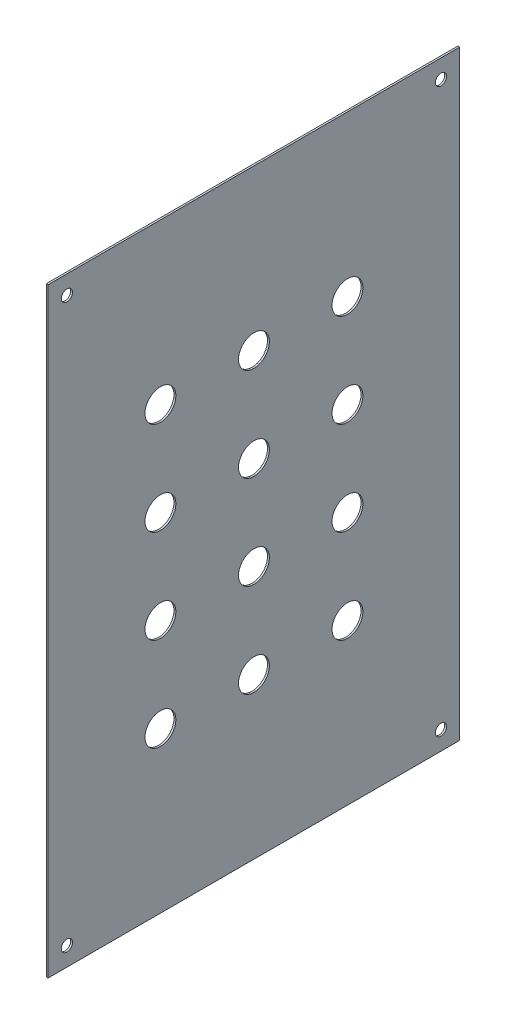
ISO-10303-21;
HEADER;
FILE_DESCRIPTION(('STEP AP214'),'2;1');
FILE_NAME('part.step','',(''),(''),'','','');
FILE_SCHEMA(('AUTOMOTIVE_DESIGN { 1 0 10303 214 1 1 1 1 }'));
ENDSEC;
DATA;
#1=APPLICATION_CONTEXT('core data for automotive mechanical design processes');
#2=APPLICATION_PROTOCOL_DEFINITION('international standard','automotive_design',2000,#1);
#3=PRODUCT_CONTEXT('',#1,'mechanical');
#4=PRODUCT('Part','Part','',(#3));
#5=PRODUCT_RELATED_PRODUCT_CATEGORY('part','',(#4));
#6=PRODUCT_DEFINITION_FORMATION('','',#4);
#7=PRODUCT_DEFINITION_CONTEXT('part definition',#1,'design');
#8=PRODUCT_DEFINITION('design','',#6,#7);
#9=PRODUCT_DEFINITION_SHAPE('','',#8);
#10=(LENGTH_UNIT() NAMED_UNIT(*) SI_UNIT(.MILLI.,.METRE.));
#11=(NAMED_UNIT(*) PLANE_ANGLE_UNIT() SI_UNIT($,.RADIAN.));
#12=(NAMED_UNIT(*) SI_UNIT($,.STERADIAN.) SOLID_ANGLE_UNIT());
#13=UNCERTAINTY_MEASURE_WITH_UNIT(LENGTH_MEASURE(1.E-05),#10,'distance_accuracy_value','');
#14=(GEOMETRIC_REPRESENTATION_CONTEXT(3) GLOBAL_UNCERTAINTY_ASSIGNED_CONTEXT((#13)) GLOBAL_UNIT_ASSIGNED_CONTEXT((#10,
#11,#12)) REPRESENTATION_CONTEXT('',''));
#15=CARTESIAN_POINT('',(0.,0.,0.));
#16=DIRECTION('',(0.,0.,1.));
#17=DIRECTION('',(1.,0.,0.));
#18=AXIS2_PLACEMENT_3D('',#15,#16,#17);
#19=CARTESIAN_POINT('',(1.,160.5,-110.));
#20=DIRECTION('',(0.,-1.,0.));
#21=DIRECTION('',(0.,0.,-1.));
#22=AXIS2_PLACEMENT_3D('',#19,#20,#21);
#23=PLANE('',#22);
#24=DIRECTION('',(0.,0.,1.));
#25=VECTOR('',#24,1.);
#26=CARTESIAN_POINT('',(0.,160.5,-110.));
#27=LINE('',#26,#25);
#28=CARTESIAN_POINT('',(0.,160.5,-110.));
#29=VERTEX_POINT('',#28);
#30=CARTESIAN_POINT('',(0.,160.5,110.));
#31=VERTEX_POINT('',#30);
#32=EDGE_CURVE('E101',#29,#31,#27,.T.);
#33=ORIENTED_EDGE('',*,*,#32,.T.);
#34=DIRECTION('',(-1.,0.,0.));
#35=VECTOR('',#34,1.);
#36=CARTESIAN_POINT('',(1.,160.5,110.));
#37=LINE('',#36,#35);
#38=CARTESIAN_POINT('',(1.,160.5,110.));
#39=VERTEX_POINT('',#38);
#40=EDGE_CURVE('E11',#39,#31,#37,.T.);
#41=ORIENTED_EDGE('',*,*,#40,.F.);
#42=DIRECTION('',(0.,0.,1.));
#43=VECTOR('',#42,1.);
#44=CARTESIAN_POINT('',(1.,160.5,-110.));
#45=LINE('',#44,#43);
#46=CARTESIAN_POINT('',(1.,160.5,-110.));
#47=VERTEX_POINT('',#46);
#48=EDGE_CURVE('E90',#47,#39,#45,.T.);
#49=ORIENTED_EDGE('',*,*,#48,.F.);
#50=DIRECTION('',(-1.,0.,0.));
#51=VECTOR('',#50,1.);
#52=CARTESIAN_POINT('',(1.,160.5,-110.));
#53=LINE('',#52,#51);
#54=EDGE_CURVE('E100',#47,#29,#53,.T.);
#55=ORIENTED_EDGE('',*,*,#54,.T.);
#56=EDGE_LOOP('',(#33,#41,#49,#55));
#57=FACE_BOUND('',#56,.T.);
#58=ADVANCED_FACE('F36',(#57),#23,.F.);
#59=CARTESIAN_POINT('',(1.,-160.5,110.));
#60=DIRECTION('',(0.,0.,-1.));
#61=DIRECTION('',(-1.,0.,0.));
#62=AXIS2_PLACEMENT_3D('',#59,#60,#61);
#63=PLANE('',#62);
#64=DIRECTION('',(0.,-1.,0.));
#65=VECTOR('',#64,1.);
#66=CARTESIAN_POINT('',(0.,-160.5,110.));
#67=LINE('',#66,#65);
#68=CARTESIAN_POINT('',(0.,-160.5,110.));
#69=VERTEX_POINT('',#68);
#70=EDGE_CURVE('E91',#31,#69,#67,.T.);
#71=ORIENTED_EDGE('',*,*,#70,.T.);
#72=DIRECTION('',(-1.,0.,0.));
#73=VECTOR('',#72,1.);
#74=CARTESIAN_POINT('',(1.,-160.5,110.));
#75=LINE('',#74,#73);
#76=CARTESIAN_POINT('',(1.,-160.5,110.));
#77=VERTEX_POINT('',#76);
#78=EDGE_CURVE('E46',#77,#69,#75,.T.);
#79=ORIENTED_EDGE('',*,*,#78,.F.);
#80=DIRECTION('',(0.,-1.,0.));
#81=VECTOR('',#80,1.);
#82=CARTESIAN_POINT('',(1.,-160.5,110.));
#83=LINE('',#82,#81);
#84=EDGE_CURVE('E82',#39,#77,#83,.T.);
#85=ORIENTED_EDGE('',*,*,#84,.F.);
#86=ORIENTED_EDGE('',*,*,#40,.T.);
#87=EDGE_LOOP('',(#71,#79,#85,#86));
#88=FACE_BOUND('',#87,.T.);
#89=ADVANCED_FACE('F95',(#88),#63,.F.);
#90=CARTESIAN_POINT('',(1.,-160.5,-110.));
#91=DIRECTION('',(0.,1.,0.));
#92=DIRECTION('',(0.,0.,1.));
#93=AXIS2_PLACEMENT_3D('',#90,#91,#92);
#94=PLANE('',#93);
#95=DIRECTION('',(0.,0.,-1.));
#96=VECTOR('',#95,1.);
#97=CARTESIAN_POINT('',(0.,-160.5,-110.));
#98=LINE('',#97,#96);
#99=CARTESIAN_POINT('',(0.,-160.5,-110.));
#100=VERTEX_POINT('',#99);
#101=EDGE_CURVE('E72',#69,#100,#98,.T.);
#102=ORIENTED_EDGE('',*,*,#101,.T.);
#103=DIRECTION('',(-1.,0.,0.));
#104=VECTOR('',#103,1.);
#105=CARTESIAN_POINT('',(1.,-160.5,-110.));
#106=LINE('',#105,#104);
#107=CARTESIAN_POINT('',(1.,-160.5,-110.));
#108=VERTEX_POINT('',#107);
#109=EDGE_CURVE('E94',#108,#100,#106,.T.);
#110=ORIENTED_EDGE('',*,*,#109,.F.);
#111=DIRECTION('',(0.,0.,-1.));
#112=VECTOR('',#111,1.);
#113=CARTESIAN_POINT('',(1.,-160.5,-110.));
#114=LINE('',#113,#112);
#115=EDGE_CURVE('E87',#77,#108,#114,.T.);
#116=ORIENTED_EDGE('',*,*,#115,.F.);
#117=ORIENTED_EDGE('',*,*,#78,.T.);
#118=EDGE_LOOP('',(#102,#110,#116,#117));
#119=FACE_BOUND('',#118,.T.);
#120=ADVANCED_FACE('F92',(#119),#94,.F.);
#121=CARTESIAN_POINT('',(1.,-160.5,-110.));
#122=DIRECTION('',(0.,0.,1.));
#123=DIRECTION('',(1.,0.,0.));
#124=AXIS2_PLACEMENT_3D('',#121,#122,#123);
#125=PLANE('',#124);
#126=DIRECTION('',(0.,1.,0.));
#127=VECTOR('',#126,1.);
#128=CARTESIAN_POINT('',(0.,-160.5,-110.));
#129=LINE('',#128,#127);
#130=EDGE_CURVE('E80',#100,#29,#129,.T.);
#131=ORIENTED_EDGE('',*,*,#130,.T.);
#132=ORIENTED_EDGE('',*,*,#54,.F.);
#133=DIRECTION('',(0.,1.,0.));
#134=VECTOR('',#133,1.);
#135=CARTESIAN_POINT('',(1.,-160.5,-110.));
#136=LINE('',#135,#134);
#137=EDGE_CURVE('E53',#108,#47,#136,.T.);
#138=ORIENTED_EDGE('',*,*,#137,.F.);
#139=ORIENTED_EDGE('',*,*,#109,.T.);
#140=EDGE_LOOP('',(#131,#132,#138,#139));
#141=FACE_BOUND('',#140,.T.);
#142=ADVANCED_FACE('F108',(#141),#125,.F.);
#143=CARTESIAN_POINT('',(1.,0.,0.));
#144=DIRECTION('',(-1.,0.,0.));
#145=DIRECTION('',(0.,0.,1.));
#146=AXIS2_PLACEMENT_3D('',#143,#144,#145);
#147=PLANE('',#146);
#148=CARTESIAN_POINT('',(1.,150.5,100.));
#149=DIRECTION('',(1.,0.,0.));
#150=DIRECTION('',(0.,0.,1.));
#151=AXIS2_PLACEMENT_3D('',#148,#149,#150);
#152=CIRCLE('',#151,2.99999999999999);
#153=CARTESIAN_POINT('',(1.,150.5,103.));
#154=VERTEX_POINT('',#153);
#155=EDGE_CURVE('E189',#154,#154,#152,.T.);
#156=ORIENTED_EDGE('',*,*,#155,.F.);
#157=EDGE_LOOP('',(#156));
#158=FACE_BOUND('',#157,.T.);
#159=CARTESIAN_POINT('',(1.,-150.5,-100.));
#160=DIRECTION('',(1.,0.,0.));
#161=DIRECTION('',(0.,0.,1.));
#162=AXIS2_PLACEMENT_3D('',#159,#160,#161);
#163=CIRCLE('',#162,2.99999999999999);
#164=CARTESIAN_POINT('',(1.,-150.5,-97.));
#165=VERTEX_POINT('',#164);
#166=EDGE_CURVE('E198',#165,#165,#163,.T.);
#167=ORIENTED_EDGE('',*,*,#166,.F.);
#168=EDGE_LOOP('',(#167));
#169=FACE_BOUND('',#168,.T.);
#170=CARTESIAN_POINT('',(1.,150.5,-100.));
#171=DIRECTION('',(1.,0.,0.));
#172=DIRECTION('',(0.,0.,-1.));
#173=AXIS2_PLACEMENT_3D('',#170,#171,#172);
#174=CIRCLE('',#173,2.99999999999999);
#175=CARTESIAN_POINT('',(1.,150.5,-103.));
#176=VERTEX_POINT('',#175);
#177=EDGE_CURVE('E197',#176,#176,#174,.T.);
#178=ORIENTED_EDGE('',*,*,#177,.F.);
#179=EDGE_LOOP('',(#178));
#180=FACE_BOUND('',#179,.T.);
#181=CARTESIAN_POINT('',(1.,-150.5,100.));
#182=DIRECTION('',(1.,0.,0.));
#183=DIRECTION('',(0.,0.,-1.));
#184=AXIS2_PLACEMENT_3D('',#181,#182,#183);
#185=CIRCLE('',#184,2.99999999999999);
#186=CARTESIAN_POINT('',(1.,-150.5,97.));
#187=VERTEX_POINT('',#186);
#188=EDGE_CURVE('E190',#187,#187,#185,.T.);
#189=ORIENTED_EDGE('',*,*,#188,.F.);
#190=EDGE_LOOP('',(#189));
#191=FACE_BOUND('',#190,.T.);
#192=CARTESIAN_POINT('',(1.,25.000000000001,-50.));
#193=DIRECTION('',(1.,0.,0.));
#194=DIRECTION('',(0.,0.,-1.));
#195=AXIS2_PLACEMENT_3D('',#192,#193,#194);
#196=CIRCLE('',#195,8.25);
#197=CARTESIAN_POINT('',(1.,25.000000000001,-58.25));
#198=VERTEX_POINT('',#197);
#199=EDGE_CURVE('E146',#198,#198,#196,.T.);
#200=ORIENTED_EDGE('',*,*,#199,.F.);
#201=EDGE_LOOP('',(#200));
#202=FACE_BOUND('',#201,.T.);
#203=CARTESIAN_POINT('',(1.,-24.999999999999,-50.));
#204=DIRECTION('',(1.,0.,0.));
#205=DIRECTION('',(0.,0.,-1.));
#206=AXIS2_PLACEMENT_3D('',#203,#204,#205);
#207=CIRCLE('',#206,8.25);
#208=CARTESIAN_POINT('',(1.,-24.999999999999,-58.25));
#209=VERTEX_POINT('',#208);
#210=EDGE_CURVE('E154',#209,#209,#207,.T.);
#211=ORIENTED_EDGE('',*,*,#210,.F.);
#212=EDGE_LOOP('',(#211));
#213=FACE_BOUND('',#212,.T.);
#214=CARTESIAN_POINT('',(1.,75.0000000000006,0.));
#215=DIRECTION('',(1.,0.,0.));
#216=DIRECTION('',(0.,0.,-1.));
#217=AXIS2_PLACEMENT_3D('',#214,#215,#216);
#218=CIRCLE('',#217,8.25);
#219=CARTESIAN_POINT('',(1.,75.0000000000006,-8.25));
#220=VERTEX_POINT('',#219);
#221=EDGE_CURVE('E161',#220,#220,#218,.T.);
#222=ORIENTED_EDGE('',*,*,#221,.F.);
#223=EDGE_LOOP('',(#222));
#224=FACE_BOUND('',#223,.T.);
#225=CARTESIAN_POINT('',(1.,25.0000000000005,0.));
#226=DIRECTION('',(1.,0.,0.));
#227=DIRECTION('',(0.,0.,-1.));
#228=AXIS2_PLACEMENT_3D('',#225,#226,#227);
#229=CIRCLE('',#228,8.25);
#230=CARTESIAN_POINT('',(1.,25.0000000000005,-8.25));
#231=VERTEX_POINT('',#230);
#232=EDGE_CURVE('E140',#231,#231,#229,.T.);
#233=ORIENTED_EDGE('',*,*,#232,.F.);
#234=EDGE_LOOP('',(#233));
#235=FACE_BOUND('',#234,.T.);
#236=CARTESIAN_POINT('',(1.,-25.,50.));
#237=DIRECTION('',(1.,0.,0.));
#238=DIRECTION('',(0.,0.,-1.));
#239=AXIS2_PLACEMENT_3D('',#236,#237,#238);
#240=CIRCLE('',#239,8.25);
#241=CARTESIAN_POINT('',(1.,-25.,41.75));
#242=VERTEX_POINT('',#241);
#243=EDGE_CURVE('E117',#242,#242,#240,.T.);
#244=ORIENTED_EDGE('',*,*,#243,.F.);
#245=EDGE_LOOP('',(#244));
#246=FACE_BOUND('',#245,.T.);
#247=CARTESIAN_POINT('',(1.,25.,50.));
#248=DIRECTION('',(1.,0.,0.));
#249=DIRECTION('',(0.,0.,-1.));
#250=AXIS2_PLACEMENT_3D('',#247,#248,#249);
#251=CIRCLE('',#250,8.25);
#252=CARTESIAN_POINT('',(1.,25.,41.75));
#253=VERTEX_POINT('',#252);
#254=EDGE_CURVE('E122',#253,#253,#251,.T.);
#255=ORIENTED_EDGE('',*,*,#254,.F.);
#256=EDGE_LOOP('',(#255));
#257=FACE_BOUND('',#256,.T.);
#258=CARTESIAN_POINT('',(1.,75.,50.));
#259=DIRECTION('',(1.,0.,0.));
#260=DIRECTION('',(0.,0.,-1.));
#261=AXIS2_PLACEMENT_3D('',#258,#259,#260);
#262=CIRCLE('',#261,8.25);
#263=CARTESIAN_POINT('',(1.,75.,41.75));
#264=VERTEX_POINT('',#263);
#265=EDGE_CURVE('E124',#264,#264,#262,.T.);
#266=ORIENTED_EDGE('',*,*,#265,.F.);
#267=EDGE_LOOP('',(#266));
#268=FACE_BOUND('',#267,.T.);
#269=CARTESIAN_POINT('',(1.,-24.9999999999995,0.));
#270=DIRECTION('',(1.,0.,0.));
#271=DIRECTION('',(0.,0.,-1.));
#272=AXIS2_PLACEMENT_3D('',#269,#270,#271);
#273=CIRCLE('',#272,8.25);
#274=CARTESIAN_POINT('',(1.,-24.9999999999995,-8.25));
#275=VERTEX_POINT('',#274);
#276=EDGE_CURVE('E138',#275,#275,#273,.T.);
#277=ORIENTED_EDGE('',*,*,#276,.F.);
#278=EDGE_LOOP('',(#277));
#279=FACE_BOUND('',#278,.T.);
#280=CARTESIAN_POINT('',(1.,-74.999999999999,-50.));
#281=DIRECTION('',(1.,0.,0.));
#282=DIRECTION('',(0.,0.,-1.));
#283=AXIS2_PLACEMENT_3D('',#280,#281,#282);
#284=CIRCLE('',#283,8.25000000000001);
#285=CARTESIAN_POINT('',(1.,-74.999999999999,-58.25));
#286=VERTEX_POINT('',#285);
#287=EDGE_CURVE('E172',#286,#286,#284,.T.);
#288=ORIENTED_EDGE('',*,*,#287,.F.);
#289=EDGE_LOOP('',(#288));
#290=FACE_BOUND('',#289,.T.);
#291=CARTESIAN_POINT('',(1.,-74.9999999999994,0.));
#292=DIRECTION('',(1.,0.,0.));
#293=DIRECTION('',(0.,0.,-1.));
#294=AXIS2_PLACEMENT_3D('',#291,#292,#293);
#295=CIRCLE('',#294,8.25000000000001);
#296=CARTESIAN_POINT('',(1.,-74.9999999999994,-8.25000000000001));
#297=VERTEX_POINT('',#296);
#298=EDGE_CURVE('E175',#297,#297,#295,.T.);
#299=ORIENTED_EDGE('',*,*,#298,.F.);
#300=EDGE_LOOP('',(#299));
#301=FACE_BOUND('',#300,.T.);
#302=CARTESIAN_POINT('',(1.,75.0000000000011,-50.));
#303=DIRECTION('',(1.,0.,0.));
#304=DIRECTION('',(0.,0.,-1.));
#305=AXIS2_PLACEMENT_3D('',#302,#303,#304);
#306=CIRCLE('',#305,8.25);
#307=CARTESIAN_POINT('',(1.,75.0000000000011,-58.25));
#308=VERTEX_POINT('',#307);
#309=EDGE_CURVE('E149',#308,#308,#306,.T.);
#310=ORIENTED_EDGE('',*,*,#309,.F.);
#311=EDGE_LOOP('',(#310));
#312=FACE_BOUND('',#311,.T.);
#313=CARTESIAN_POINT('',(1.,-75.,50.));
#314=DIRECTION('',(1.,0.,0.));
#315=DIRECTION('',(0.,0.,-1.));
#316=AXIS2_PLACEMENT_3D('',#313,#314,#315);
#317=CIRCLE('',#316,8.25);
#318=CARTESIAN_POINT('',(1.,-75.,41.75));
#319=VERTEX_POINT('',#318);
#320=EDGE_CURVE('E113',#319,#319,#317,.T.);
#321=ORIENTED_EDGE('',*,*,#320,.F.);
#322=EDGE_LOOP('',(#321));
#323=FACE_BOUND('',#322,.T.);
#324=ORIENTED_EDGE('',*,*,#48,.T.);
#325=ORIENTED_EDGE('',*,*,#84,.T.);
#326=ORIENTED_EDGE('',*,*,#115,.T.);
#327=ORIENTED_EDGE('',*,*,#137,.T.);
#328=EDGE_LOOP('',(#324,#325,#326,#327));
#329=FACE_BOUND('',#328,.T.);
#330=ADVANCED_FACE('F84',(#158,#169,#180,#191,#202,#213,#224,#235,#246,#257,#268,#279,#290,#301,
#312,#323,#329),#147,.F.);
#331=CARTESIAN_POINT('',(0.,0.,0.));
#332=DIRECTION('',(-1.,0.,0.));
#333=DIRECTION('',(0.,0.,1.));
#334=AXIS2_PLACEMENT_3D('',#331,#332,#333);
#335=PLANE('',#334);
#336=CARTESIAN_POINT('',(0.,150.5,100.));
#337=DIRECTION('',(1.,0.,0.));
#338=DIRECTION('',(0.,0.,1.));
#339=AXIS2_PLACEMENT_3D('',#336,#337,#338);
#340=CIRCLE('',#339,2.99999999999999);
#341=CARTESIAN_POINT('',(0.,150.5,103.));
#342=VERTEX_POINT('',#341);
#343=EDGE_CURVE('E199',#342,#342,#340,.T.);
#344=ORIENTED_EDGE('',*,*,#343,.T.);
#345=EDGE_LOOP('',(#344));
#346=FACE_BOUND('',#345,.T.);
#347=CARTESIAN_POINT('',(0.,-150.5,-100.));
#348=DIRECTION('',(1.,0.,0.));
#349=DIRECTION('',(0.,0.,1.));
#350=AXIS2_PLACEMENT_3D('',#347,#348,#349);
#351=CIRCLE('',#350,2.99999999999999);
#352=CARTESIAN_POINT('',(0.,-150.5,-97.));
#353=VERTEX_POINT('',#352);
#354=EDGE_CURVE('E191',#353,#353,#351,.T.);
#355=ORIENTED_EDGE('',*,*,#354,.T.);
#356=EDGE_LOOP('',(#355));
#357=FACE_BOUND('',#356,.T.);
#358=CARTESIAN_POINT('',(0.,150.5,-100.));
#359=DIRECTION('',(1.,0.,0.));
#360=DIRECTION('',(0.,0.,-1.));
#361=AXIS2_PLACEMENT_3D('',#358,#359,#360);
#362=CIRCLE('',#361,2.99999999999999);
#363=CARTESIAN_POINT('',(0.,150.5,-103.));
#364=VERTEX_POINT('',#363);
#365=EDGE_CURVE('E202',#364,#364,#362,.T.);
#366=ORIENTED_EDGE('',*,*,#365,.T.);
#367=EDGE_LOOP('',(#366));
#368=FACE_BOUND('',#367,.T.);
#369=CARTESIAN_POINT('',(0.,-150.5,100.));
#370=DIRECTION('',(1.,0.,0.));
#371=DIRECTION('',(0.,0.,-1.));
#372=AXIS2_PLACEMENT_3D('',#369,#370,#371);
#373=CIRCLE('',#372,2.99999999999999);
#374=CARTESIAN_POINT('',(0.,-150.5,97.));
#375=VERTEX_POINT('',#374);
#376=EDGE_CURVE('E184',#375,#375,#373,.T.);
#377=ORIENTED_EDGE('',*,*,#376,.T.);
#378=EDGE_LOOP('',(#377));
#379=FACE_BOUND('',#378,.T.);
#380=CARTESIAN_POINT('',(0.,25.000000000001,-50.));
#381=DIRECTION('',(1.,0.,0.));
#382=DIRECTION('',(0.,0.,-1.));
#383=AXIS2_PLACEMENT_3D('',#380,#381,#382);
#384=CIRCLE('',#383,8.25);
#385=CARTESIAN_POINT('',(0.,25.000000000001,-58.25));
#386=VERTEX_POINT('',#385);
#387=EDGE_CURVE('E144',#386,#386,#384,.T.);
#388=ORIENTED_EDGE('',*,*,#387,.T.);
#389=EDGE_LOOP('',(#388));
#390=FACE_BOUND('',#389,.T.);
#391=CARTESIAN_POINT('',(0.,-24.999999999999,-50.));
#392=DIRECTION('',(1.,0.,0.));
#393=DIRECTION('',(0.,0.,-1.));
#394=AXIS2_PLACEMENT_3D('',#391,#392,#393);
#395=CIRCLE('',#394,8.25);
#396=CARTESIAN_POINT('',(0.,-24.999999999999,-58.25));
#397=VERTEX_POINT('',#396);
#398=EDGE_CURVE('E155',#397,#397,#395,.T.);
#399=ORIENTED_EDGE('',*,*,#398,.T.);
#400=EDGE_LOOP('',(#399));
#401=FACE_BOUND('',#400,.T.);
#402=CARTESIAN_POINT('',(0.,75.0000000000006,0.));
#403=DIRECTION('',(1.,0.,0.));
#404=DIRECTION('',(0.,0.,-1.));
#405=AXIS2_PLACEMENT_3D('',#402,#403,#404);
#406=CIRCLE('',#405,8.25);
#407=CARTESIAN_POINT('',(0.,75.0000000000006,-8.25));
#408=VERTEX_POINT('',#407);
#409=EDGE_CURVE('E158',#408,#408,#406,.T.);
#410=ORIENTED_EDGE('',*,*,#409,.T.);
#411=EDGE_LOOP('',(#410));
#412=FACE_BOUND('',#411,.T.);
#413=CARTESIAN_POINT('',(0.,25.0000000000005,0.));
#414=DIRECTION('',(1.,0.,0.));
#415=DIRECTION('',(0.,0.,-1.));
#416=AXIS2_PLACEMENT_3D('',#413,#414,#415);
#417=CIRCLE('',#416,8.25);
#418=CARTESIAN_POINT('',(0.,25.0000000000005,-8.25));
#419=VERTEX_POINT('',#418);
#420=EDGE_CURVE('E163',#419,#419,#417,.T.);
#421=ORIENTED_EDGE('',*,*,#420,.T.);
#422=EDGE_LOOP('',(#421));
#423=FACE_BOUND('',#422,.T.);
#424=CARTESIAN_POINT('',(0.,-25.,50.));
#425=DIRECTION('',(1.,0.,0.));
#426=DIRECTION('',(0.,0.,-1.));
#427=AXIS2_PLACEMENT_3D('',#424,#425,#426);
#428=CIRCLE('',#427,8.25);
#429=CARTESIAN_POINT('',(0.,-25.,41.75));
#430=VERTEX_POINT('',#429);
#431=EDGE_CURVE('E126',#430,#430,#428,.T.);
#432=ORIENTED_EDGE('',*,*,#431,.T.);
#433=EDGE_LOOP('',(#432));
#434=FACE_BOUND('',#433,.T.);
#435=CARTESIAN_POINT('',(0.,25.,50.));
#436=DIRECTION('',(1.,0.,0.));
#437=DIRECTION('',(0.,0.,-1.));
#438=AXIS2_PLACEMENT_3D('',#435,#436,#437);
#439=CIRCLE('',#438,8.25);
#440=CARTESIAN_POINT('',(0.,25.,41.75));
#441=VERTEX_POINT('',#440);
#442=EDGE_CURVE('E123',#441,#441,#439,.T.);
#443=ORIENTED_EDGE('',*,*,#442,.T.);
#444=EDGE_LOOP('',(#443));
#445=FACE_BOUND('',#444,.T.);
#446=CARTESIAN_POINT('',(0.,75.,50.));
#447=DIRECTION('',(1.,0.,0.));
#448=DIRECTION('',(0.,0.,-1.));
#449=AXIS2_PLACEMENT_3D('',#446,#447,#448);
#450=CIRCLE('',#449,8.25);
#451=CARTESIAN_POINT('',(0.,75.,41.75));
#452=VERTEX_POINT('',#451);
#453=EDGE_CURVE('E139',#452,#452,#450,.T.);
#454=ORIENTED_EDGE('',*,*,#453,.T.);
#455=EDGE_LOOP('',(#454));
#456=FACE_BOUND('',#455,.T.);
#457=CARTESIAN_POINT('',(0.,-24.9999999999995,0.));
#458=DIRECTION('',(1.,0.,0.));
#459=DIRECTION('',(0.,0.,-1.));
#460=AXIS2_PLACEMENT_3D('',#457,#458,#459);
#461=CIRCLE('',#460,8.25);
#462=CARTESIAN_POINT('',(0.,-24.9999999999995,-8.25));
#463=VERTEX_POINT('',#462);
#464=EDGE_CURVE('E132',#463,#463,#461,.T.);
#465=ORIENTED_EDGE('',*,*,#464,.T.);
#466=EDGE_LOOP('',(#465));
#467=FACE_BOUND('',#466,.T.);
#468=CARTESIAN_POINT('',(0.,-74.999999999999,-50.));
#469=DIRECTION('',(1.,0.,0.));
#470=DIRECTION('',(0.,0.,-1.));
#471=AXIS2_PLACEMENT_3D('',#468,#469,#470);
#472=CIRCLE('',#471,8.25000000000001);
#473=CARTESIAN_POINT('',(0.,-74.999999999999,-58.25));
#474=VERTEX_POINT('',#473);
#475=EDGE_CURVE('E182',#474,#474,#472,.T.);
#476=ORIENTED_EDGE('',*,*,#475,.T.);
#477=EDGE_LOOP('',(#476));
#478=FACE_BOUND('',#477,.T.);
#479=CARTESIAN_POINT('',(0.,-74.9999999999994,0.));
#480=DIRECTION('',(1.,0.,0.));
#481=DIRECTION('',(0.,0.,-1.));
#482=AXIS2_PLACEMENT_3D('',#479,#480,#481);
#483=CIRCLE('',#482,8.25000000000001);
#484=CARTESIAN_POINT('',(0.,-74.9999999999994,-8.25000000000001));
#485=VERTEX_POINT('',#484);
#486=EDGE_CURVE('E166',#485,#485,#483,.T.);
#487=ORIENTED_EDGE('',*,*,#486,.T.);
#488=EDGE_LOOP('',(#487));
#489=FACE_BOUND('',#488,.T.);
#490=CARTESIAN_POINT('',(0.,75.0000000000011,-50.));
#491=DIRECTION('',(1.,0.,0.));
#492=DIRECTION('',(0.,0.,-1.));
#493=AXIS2_PLACEMENT_3D('',#490,#491,#492);
#494=CIRCLE('',#493,8.25);
#495=CARTESIAN_POINT('',(0.,75.0000000000011,-58.25));
#496=VERTEX_POINT('',#495);
#497=EDGE_CURVE('E178',#496,#496,#494,.T.);
#498=ORIENTED_EDGE('',*,*,#497,.T.);
#499=EDGE_LOOP('',(#498));
#500=FACE_BOUND('',#499,.T.);
#501=CARTESIAN_POINT('',(0.,-75.,50.));
#502=DIRECTION('',(1.,0.,0.));
#503=DIRECTION('',(0.,0.,-1.));
#504=AXIS2_PLACEMENT_3D('',#501,#502,#503);
#505=CIRCLE('',#504,8.25);
#506=CARTESIAN_POINT('',(0.,-75.,41.75));
#507=VERTEX_POINT('',#506);
#508=EDGE_CURVE('E102',#507,#507,#505,.T.);
#509=ORIENTED_EDGE('',*,*,#508,.T.);
#510=EDGE_LOOP('',(#509));
#511=FACE_BOUND('',#510,.T.);
#512=ORIENTED_EDGE('',*,*,#32,.F.);
#513=ORIENTED_EDGE('',*,*,#130,.F.);
#514=ORIENTED_EDGE('',*,*,#101,.F.);
#515=ORIENTED_EDGE('',*,*,#70,.F.);
#516=EDGE_LOOP('',(#512,#513,#514,#515));
#517=FACE_BOUND('',#516,.T.);
#518=ADVANCED_FACE('F115',(#346,#357,#368,#379,#390,#401,#412,#423,#434,#445,#456,#467,#478,
#489,#500,#511,#517),#335,.T.);
#519=CARTESIAN_POINT('',(0.,-75.,50.));
#520=DIRECTION('',(1.,0.,0.));
#521=DIRECTION('',(0.,0.,-1.));
#522=AXIS2_PLACEMENT_3D('',#519,#520,#521);
#523=CYLINDRICAL_SURFACE('',#522,8.25);
#524=ORIENTED_EDGE('',*,*,#508,.F.);
#525=EDGE_LOOP('',(#524));
#526=FACE_BOUND('',#525,.T.);
#527=ORIENTED_EDGE('',*,*,#320,.T.);
#528=EDGE_LOOP('',(#527));
#529=FACE_BOUND('',#528,.T.);
#530=ADVANCED_FACE('F242',(#526,#529),#523,.F.);
#531=CARTESIAN_POINT('',(0.,75.0000000000011,-50.));
#532=DIRECTION('',(1.,0.,0.));
#533=DIRECTION('',(0.,0.,-1.));
#534=AXIS2_PLACEMENT_3D('',#531,#532,#533);
#535=CYLINDRICAL_SURFACE('',#534,8.25);
#536=ORIENTED_EDGE('',*,*,#497,.F.);
#537=EDGE_LOOP('',(#536));
#538=FACE_BOUND('',#537,.T.);
#539=ORIENTED_EDGE('',*,*,#309,.T.);
#540=EDGE_LOOP('',(#539));
#541=FACE_BOUND('',#540,.T.);
#542=ADVANCED_FACE('F244',(#538,#541),#535,.F.);
#543=CARTESIAN_POINT('',(0.,-74.9999999999994,0.));
#544=DIRECTION('',(1.,0.,0.));
#545=DIRECTION('',(0.,0.,-1.));
#546=AXIS2_PLACEMENT_3D('',#543,#544,#545);
#547=CYLINDRICAL_SURFACE('',#546,8.25000000000001);
#548=ORIENTED_EDGE('',*,*,#486,.F.);
#549=EDGE_LOOP('',(#548));
#550=FACE_BOUND('',#549,.T.);
#551=ORIENTED_EDGE('',*,*,#298,.T.);
#552=EDGE_LOOP('',(#551));
#553=FACE_BOUND('',#552,.T.);
#554=ADVANCED_FACE('F252',(#550,#553),#547,.F.);
#555=CARTESIAN_POINT('',(0.,-74.999999999999,-50.));
#556=DIRECTION('',(1.,0.,0.));
#557=DIRECTION('',(0.,0.,-1.));
#558=AXIS2_PLACEMENT_3D('',#555,#556,#557);
#559=CYLINDRICAL_SURFACE('',#558,8.25000000000001);
#560=ORIENTED_EDGE('',*,*,#475,.F.);
#561=EDGE_LOOP('',(#560));
#562=FACE_BOUND('',#561,.T.);
#563=ORIENTED_EDGE('',*,*,#287,.T.);
#564=EDGE_LOOP('',(#563));
#565=FACE_BOUND('',#564,.T.);
#566=ADVANCED_FACE('F311',(#562,#565),#559,.F.);
#567=CARTESIAN_POINT('',(0.,-24.9999999999995,0.));
#568=DIRECTION('',(1.,0.,0.));
#569=DIRECTION('',(0.,0.,-1.));
#570=AXIS2_PLACEMENT_3D('',#567,#568,#569);
#571=CYLINDRICAL_SURFACE('',#570,8.25);
#572=ORIENTED_EDGE('',*,*,#464,.F.);
#573=EDGE_LOOP('',(#572));
#574=FACE_BOUND('',#573,.T.);
#575=ORIENTED_EDGE('',*,*,#276,.T.);
#576=EDGE_LOOP('',(#575));
#577=FACE_BOUND('',#576,.T.);
#578=ADVANCED_FACE('F325',(#574,#577),#571,.F.);
#579=CARTESIAN_POINT('',(0.,75.,50.));
#580=DIRECTION('',(1.,0.,0.));
#581=DIRECTION('',(0.,0.,-1.));
#582=AXIS2_PLACEMENT_3D('',#579,#580,#581);
#583=CYLINDRICAL_SURFACE('',#582,8.25);
#584=ORIENTED_EDGE('',*,*,#453,.F.);
#585=EDGE_LOOP('',(#584));
#586=FACE_BOUND('',#585,.T.);
#587=ORIENTED_EDGE('',*,*,#265,.T.);
#588=EDGE_LOOP('',(#587));
#589=FACE_BOUND('',#588,.T.);
#590=ADVANCED_FACE('F332',(#586,#589),#583,.F.);
#591=CARTESIAN_POINT('',(0.,25.,50.));
#592=DIRECTION('',(1.,0.,0.));
#593=DIRECTION('',(0.,0.,-1.));
#594=AXIS2_PLACEMENT_3D('',#591,#592,#593);
#595=CYLINDRICAL_SURFACE('',#594,8.25);
#596=ORIENTED_EDGE('',*,*,#442,.F.);
#597=EDGE_LOOP('',(#596));
#598=FACE_BOUND('',#597,.T.);
#599=ORIENTED_EDGE('',*,*,#254,.T.);
#600=EDGE_LOOP('',(#599));
#601=FACE_BOUND('',#600,.T.);
#602=ADVANCED_FACE('F339',(#598,#601),#595,.F.);
#603=CARTESIAN_POINT('',(0.,-25.,50.));
#604=DIRECTION('',(1.,0.,0.));
#605=DIRECTION('',(0.,0.,-1.));
#606=AXIS2_PLACEMENT_3D('',#603,#604,#605);
#607=CYLINDRICAL_SURFACE('',#606,8.25);
#608=ORIENTED_EDGE('',*,*,#431,.F.);
#609=EDGE_LOOP('',(#608));
#610=FACE_BOUND('',#609,.T.);
#611=ORIENTED_EDGE('',*,*,#243,.T.);
#612=EDGE_LOOP('',(#611));
#613=FACE_BOUND('',#612,.T.);
#614=ADVANCED_FACE('F349',(#610,#613),#607,.F.);
#615=CARTESIAN_POINT('',(0.,25.0000000000005,0.));
#616=DIRECTION('',(1.,0.,0.));
#617=DIRECTION('',(0.,0.,-1.));
#618=AXIS2_PLACEMENT_3D('',#615,#616,#617);
#619=CYLINDRICAL_SURFACE('',#618,8.25);
#620=ORIENTED_EDGE('',*,*,#420,.F.);
#621=EDGE_LOOP('',(#620));
#622=FACE_BOUND('',#621,.T.);
#623=ORIENTED_EDGE('',*,*,#232,.T.);
#624=EDGE_LOOP('',(#623));
#625=FACE_BOUND('',#624,.T.);
#626=ADVANCED_FACE('F360',(#622,#625),#619,.F.);
#627=CARTESIAN_POINT('',(0.,75.0000000000006,0.));
#628=DIRECTION('',(1.,0.,0.));
#629=DIRECTION('',(0.,0.,-1.));
#630=AXIS2_PLACEMENT_3D('',#627,#628,#629);
#631=CYLINDRICAL_SURFACE('',#630,8.25);
#632=ORIENTED_EDGE('',*,*,#409,.F.);
#633=EDGE_LOOP('',(#632));
#634=FACE_BOUND('',#633,.T.);
#635=ORIENTED_EDGE('',*,*,#221,.T.);
#636=EDGE_LOOP('',(#635));
#637=FACE_BOUND('',#636,.T.);
#638=ADVANCED_FACE('F368',(#634,#637),#631,.F.);
#639=CARTESIAN_POINT('',(0.,-24.999999999999,-50.));
#640=DIRECTION('',(1.,0.,0.));
#641=DIRECTION('',(0.,0.,-1.));
#642=AXIS2_PLACEMENT_3D('',#639,#640,#641);
#643=CYLINDRICAL_SURFACE('',#642,8.25);
#644=ORIENTED_EDGE('',*,*,#398,.F.);
#645=EDGE_LOOP('',(#644));
#646=FACE_BOUND('',#645,.T.);
#647=ORIENTED_EDGE('',*,*,#210,.T.);
#648=EDGE_LOOP('',(#647));
#649=FACE_BOUND('',#648,.T.);
#650=ADVANCED_FACE('F374',(#646,#649),#643,.F.);
#651=CARTESIAN_POINT('',(0.,25.000000000001,-50.));
#652=DIRECTION('',(1.,0.,0.));
#653=DIRECTION('',(0.,0.,-1.));
#654=AXIS2_PLACEMENT_3D('',#651,#652,#653);
#655=CYLINDRICAL_SURFACE('',#654,8.25);
#656=ORIENTED_EDGE('',*,*,#387,.F.);
#657=EDGE_LOOP('',(#656));
#658=FACE_BOUND('',#657,.T.);
#659=ORIENTED_EDGE('',*,*,#199,.T.);
#660=EDGE_LOOP('',(#659));
#661=FACE_BOUND('',#660,.T.);
#662=ADVANCED_FACE('F383',(#658,#661),#655,.F.);
#663=CARTESIAN_POINT('',(0.,-150.5,100.));
#664=DIRECTION('',(1.,0.,0.));
#665=DIRECTION('',(0.,0.,-1.));
#666=AXIS2_PLACEMENT_3D('',#663,#664,#665);
#667=CYLINDRICAL_SURFACE('',#666,2.99999999999999);
#668=ORIENTED_EDGE('',*,*,#376,.F.);
#669=EDGE_LOOP('',(#668));
#670=FACE_BOUND('',#669,.T.);
#671=ORIENTED_EDGE('',*,*,#188,.T.);
#672=EDGE_LOOP('',(#671));
#673=FACE_BOUND('',#672,.T.);
#674=ADVANCED_FACE('F392',(#670,#673),#667,.F.);
#675=CARTESIAN_POINT('',(0.,150.5,-100.));
#676=DIRECTION('',(1.,0.,0.));
#677=DIRECTION('',(0.,0.,-1.));
#678=AXIS2_PLACEMENT_3D('',#675,#676,#677);
#679=CYLINDRICAL_SURFACE('',#678,2.99999999999999);
#680=ORIENTED_EDGE('',*,*,#365,.F.);
#681=EDGE_LOOP('',(#680));
#682=FACE_BOUND('',#681,.T.);
#683=ORIENTED_EDGE('',*,*,#177,.T.);
#684=EDGE_LOOP('',(#683));
#685=FACE_BOUND('',#684,.T.);
#686=ADVANCED_FACE('F211',(#682,#685),#679,.F.);
#687=CARTESIAN_POINT('',(0.,-150.5,-100.));
#688=DIRECTION('',(1.,0.,0.));
#689=DIRECTION('',(0.,0.,-1.));
#690=AXIS2_PLACEMENT_3D('',#687,#688,#689);
#691=CYLINDRICAL_SURFACE('',#690,2.99999999999999);
#692=ORIENTED_EDGE('',*,*,#354,.F.);
#693=EDGE_LOOP('',(#692));
#694=FACE_BOUND('',#693,.T.);
#695=ORIENTED_EDGE('',*,*,#166,.T.);
#696=EDGE_LOOP('',(#695));
#697=FACE_BOUND('',#696,.T.);
#698=ADVANCED_FACE('F409',(#694,#697),#691,.F.);
#699=CARTESIAN_POINT('',(0.,150.5,100.));
#700=DIRECTION('',(1.,0.,0.));
#701=DIRECTION('',(0.,0.,-1.));
#702=AXIS2_PLACEMENT_3D('',#699,#700,#701);
#703=CYLINDRICAL_SURFACE('',#702,2.99999999999999);
#704=ORIENTED_EDGE('',*,*,#343,.F.);
#705=EDGE_LOOP('',(#704));
#706=FACE_BOUND('',#705,.T.);
#707=ORIENTED_EDGE('',*,*,#155,.T.);
#708=EDGE_LOOP('',(#707));
#709=FACE_BOUND('',#708,.T.);
#710=ADVANCED_FACE('F420',(#706,#709),#703,.F.);
#711=CLOSED_SHELL('',(#58,#89,#120,#142,#330,#518,#530,#542,#554,#566,#578,#590,#602,#614,#626,
#638,#650,#662,#674,#686,#698,#710));
#712=MANIFOLD_SOLID_BREP('B2',#711);
#713=ADVANCED_BREP_SHAPE_REPRESENTATION('',(#18,#712),#14);
#714=SHAPE_DEFINITION_REPRESENTATION(#9,#713);
ENDSEC;
END-ISO-10303-21;
